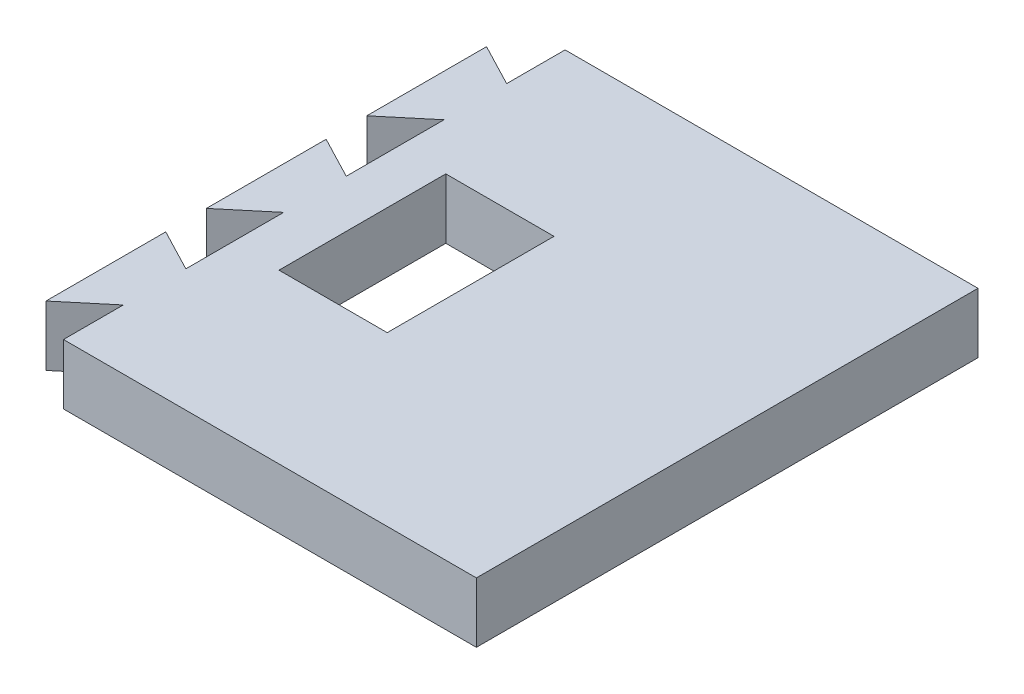
ISO-10303-21;
HEADER;
FILE_DESCRIPTION(('STEP AP214'),'2;1');
FILE_NAME('part.step','',(''),(''),'','','');
FILE_SCHEMA(('AUTOMOTIVE_DESIGN { 1 0 10303 214 1 1 1 1 }'));
ENDSEC;
DATA;
#1=APPLICATION_CONTEXT('core data for automotive mechanical design processes');
#2=APPLICATION_PROTOCOL_DEFINITION('international standard','automotive_design',2000,#1);
#3=PRODUCT_CONTEXT('',#1,'mechanical');
#4=PRODUCT('Part','Part','',(#3));
#5=PRODUCT_RELATED_PRODUCT_CATEGORY('part','',(#4));
#6=PRODUCT_DEFINITION_FORMATION('','',#4);
#7=PRODUCT_DEFINITION_CONTEXT('part definition',#1,'design');
#8=PRODUCT_DEFINITION('design','',#6,#7);
#9=PRODUCT_DEFINITION_SHAPE('','',#8);
#10=(LENGTH_UNIT() NAMED_UNIT(*) SI_UNIT(.MILLI.,.METRE.));
#11=(NAMED_UNIT(*) PLANE_ANGLE_UNIT() SI_UNIT($,.RADIAN.));
#12=(NAMED_UNIT(*) SI_UNIT($,.STERADIAN.) SOLID_ANGLE_UNIT());
#13=UNCERTAINTY_MEASURE_WITH_UNIT(LENGTH_MEASURE(1.E-05),#10,'distance_accuracy_value','');
#14=(GEOMETRIC_REPRESENTATION_CONTEXT(3) GLOBAL_UNCERTAINTY_ASSIGNED_CONTEXT((#13)) GLOBAL_UNIT_ASSIGNED_CONTEXT((#10,
#11,#12)) REPRESENTATION_CONTEXT('',''));
#15=CARTESIAN_POINT('',(0.,0.,0.));
#16=DIRECTION('',(0.,0.,1.));
#17=DIRECTION('',(1.,0.,0.));
#18=AXIS2_PLACEMENT_3D('',#15,#16,#17);
#19=CARTESIAN_POINT('',(0.,15.,0.));
#20=DIRECTION('',(0.,1.,0.));
#21=DIRECTION('',(0.,0.,1.));
#22=AXIS2_PLACEMENT_3D('',#19,#20,#21);
#23=PLANE('',#22);
#24=DIRECTION('',(0.,0.,-1.));
#25=VECTOR('',#24,1.);
#26=CARTESIAN_POINT('',(21.1122765900596,15.,-62.3478624727913));
#27=LINE('',#26,#25);
#28=CARTESIAN_POINT('',(21.1122765900596,15.,-47.9762770127913));
#29=VERTEX_POINT('',#28);
#30=CARTESIAN_POINT('',(21.1122765900596,15.,-62.5478624738082));
#31=VERTEX_POINT('',#30);
#32=EDGE_CURVE('E210',#29,#31,#27,.T.);
#33=ORIENTED_EDGE('',*,*,#32,.F.);
#34=DIRECTION('',(0.88658530162317,0.,0.462565133733351));
#35=VECTOR('',#34,1.);
#36=CARTESIAN_POINT('',(21.1122765900596,15.,-47.9762770127913));
#37=LINE('',#36,#35);
#38=CARTESIAN_POINT('',(10.6179622408717,15.,-53.4515583100163));
#39=VERTEX_POINT('',#38);
#40=EDGE_CURVE('E290',#39,#29,#37,.T.);
#41=ORIENTED_EDGE('',*,*,#40,.F.);
#42=DIRECTION('',(0.,0.,-1.));
#43=VECTOR('',#42,1.);
#44=CARTESIAN_POINT('',(10.6179622408717,15.,-53.4515583100163));
#45=LINE('',#44,#43);
#46=CARTESIAN_POINT('',(10.6179622408717,15.,-23.5922642500163));
#47=VERTEX_POINT('',#46);
#48=EDGE_CURVE('E286',#47,#39,#45,.T.);
#49=ORIENTED_EDGE('',*,*,#48,.F.);
#50=DIRECTION('',(-0.767024936948259,0.,0.641617289433132));
#51=VECTOR('',#50,1.);
#52=CARTESIAN_POINT('',(10.6179622408717,15.,-23.5922642500163));
#53=LINE('',#52,#51);
#54=CARTESIAN_POINT('',(21.1122765900596,15.,-32.3707709227913));
#55=VERTEX_POINT('',#54);
#56=EDGE_CURVE('E282',#55,#47,#53,.T.);
#57=ORIENTED_EDGE('',*,*,#56,.F.);
#58=DIRECTION('',(0.,0.,-1.));
#59=VECTOR('',#58,1.);
#60=CARTESIAN_POINT('',(21.1122765900596,15.,-32.3707709227913));
#61=LINE('',#60,#59);
#62=CARTESIAN_POINT('',(21.1122765900596,15.,-7.97627701279131));
#63=VERTEX_POINT('',#62);
#64=EDGE_CURVE('E278',#63,#55,#61,.T.);
#65=ORIENTED_EDGE('',*,*,#64,.F.);
#66=DIRECTION('',(0.88658530162317,0.,0.462565133733351));
#67=VECTOR('',#66,1.);
#68=CARTESIAN_POINT('',(21.1122765900596,15.,-7.97627701279131));
#69=LINE('',#68,#67);
#70=CARTESIAN_POINT('',(10.6179622408717,15.,-13.4515583100163));
#71=VERTEX_POINT('',#70);
#72=EDGE_CURVE('E274',#71,#63,#69,.T.);
#73=ORIENTED_EDGE('',*,*,#72,.F.);
#74=DIRECTION('',(0.,0.,-1.));
#75=VECTOR('',#74,1.);
#76=CARTESIAN_POINT('',(10.6179622408717,15.,-13.4515583100163));
#77=LINE('',#76,#75);
#78=CARTESIAN_POINT('',(10.6179622408717,15.,16.4077357499837));
#79=VERTEX_POINT('',#78);
#80=EDGE_CURVE('E270',#79,#71,#77,.T.);
#81=ORIENTED_EDGE('',*,*,#80,.F.);
#82=DIRECTION('',(-0.767024936948259,0.,0.641617289433132));
#83=VECTOR('',#82,1.);
#84=CARTESIAN_POINT('',(10.6179622408717,15.,16.4077357499837));
#85=LINE('',#84,#83);
#86=CARTESIAN_POINT('',(21.1122765900596,15.,7.62922907720868));
#87=VERTEX_POINT('',#86);
#88=EDGE_CURVE('E266',#87,#79,#85,.T.);
#89=ORIENTED_EDGE('',*,*,#88,.F.);
#90=DIRECTION('',(0.,0.,-1.));
#91=VECTOR('',#90,1.);
#92=CARTESIAN_POINT('',(21.1122765900596,15.,7.62922907720868));
#93=LINE('',#92,#91);
#94=CARTESIAN_POINT('',(21.1122765900596,15.,32.0237229872087));
#95=VERTEX_POINT('',#94);
#96=EDGE_CURVE('E262',#95,#87,#93,.T.);
#97=ORIENTED_EDGE('',*,*,#96,.F.);
#98=DIRECTION('',(0.886585301623169,0.,0.462565133733352));
#99=VECTOR('',#98,1.);
#100=CARTESIAN_POINT('',(21.1122765900596,15.,32.0237229872087));
#101=LINE('',#100,#99);
#102=CARTESIAN_POINT('',(10.6179622408717,15.,26.5484416899837));
#103=VERTEX_POINT('',#102);
#104=EDGE_CURVE('E258',#103,#95,#101,.T.);
#105=ORIENTED_EDGE('',*,*,#104,.F.);
#106=DIRECTION('',(0.,0.,-1.));
#107=VECTOR('',#106,1.);
#108=CARTESIAN_POINT('',(10.6179622408717,15.,26.5484416899837));
#109=LINE('',#108,#107);
#110=CARTESIAN_POINT('',(10.6179622408717,15.,56.4077357499837));
#111=VERTEX_POINT('',#110);
#112=EDGE_CURVE('E255',#111,#103,#109,.T.);
#113=ORIENTED_EDGE('',*,*,#112,.F.);
#114=DIRECTION('',(-0.767024936948259,0.,0.641617289433132));
#115=VECTOR('',#114,1.);
#116=CARTESIAN_POINT('',(10.6179622408717,15.,56.4077357499837));
#117=LINE('',#116,#115);
#118=CARTESIAN_POINT('',(21.1122765900596,15.,47.6292290772087));
#119=VERTEX_POINT('',#118);
#120=EDGE_CURVE('E186',#119,#111,#117,.T.);
#121=ORIENTED_EDGE('',*,*,#120,.F.);
#122=DIRECTION('',(0.,0.,-1.));
#123=VECTOR('',#122,1.);
#124=CARTESIAN_POINT('',(21.1122765900596,15.,47.6292290772087));
#125=LINE('',#124,#123);
#126=CARTESIAN_POINT('',(21.1122765900596,15.,62.5478624738082));
#127=VERTEX_POINT('',#126);
#128=EDGE_CURVE('E250',#127,#119,#125,.T.);
#129=ORIENTED_EDGE('',*,*,#128,.F.);
#130=DIRECTION('',(-1.,0.,0.));
#131=VECTOR('',#130,1.);
#132=CARTESIAN_POINT('',(0.,15.,62.5478624738082));
#133=LINE('',#132,#131);
#134=CARTESIAN_POINT('',(124.086888456103,15.,62.5478624738082));
#135=VERTEX_POINT('',#134);
#136=EDGE_CURVE('E11',#135,#127,#133,.T.);
#137=ORIENTED_EDGE('',*,*,#136,.F.);
#138=DIRECTION('',(0.,0.,1.));
#139=VECTOR('',#138,1.);
#140=CARTESIAN_POINT('',(124.086888456103,15.,0.));
#141=LINE('',#140,#139);
#142=CARTESIAN_POINT('',(124.086888456103,15.,-62.5478624738082));
#143=VERTEX_POINT('',#142);
#144=EDGE_CURVE('E53',#143,#135,#141,.T.);
#145=ORIENTED_EDGE('',*,*,#144,.F.);
#146=DIRECTION('',(-1.,0.,0.));
#147=VECTOR('',#146,1.);
#148=CARTESIAN_POINT('',(0.,15.,-62.5478624738082));
#149=LINE('',#148,#147);
#150=EDGE_CURVE('E368',#143,#31,#149,.T.);
#151=ORIENTED_EDGE('',*,*,#150,.T.);
#152=EDGE_LOOP('',(#33,#41,#49,#57,#65,#73,#81,#89,#97,#105,#113,#121,#129,#137,#145,#151));
#153=FACE_BOUND('',#152,.T.);
#154=DIRECTION('',(-1.,0.,0.));
#155=VECTOR('',#154,1.);
#156=CARTESIAN_POINT('',(60.,15.,-20.8977631628507));
#157=LINE('',#156,#155);
#158=CARTESIAN_POINT('',(60.,15.,-20.8977631628507));
#159=VERTEX_POINT('',#158);
#160=CARTESIAN_POINT('',(33.01537257,15.,-20.8977631628507));
#161=VERTEX_POINT('',#160);
#162=EDGE_CURVE('E69',#159,#161,#157,.T.);
#163=ORIENTED_EDGE('',*,*,#162,.F.);
#164=DIRECTION('',(0.,0.,-1.));
#165=VECTOR('',#164,1.);
#166=CARTESIAN_POINT('',(60.,15.,-20.8977631628507));
#167=LINE('',#166,#165);
#168=CARTESIAN_POINT('',(60.,15.,20.6977631671492));
#169=VERTEX_POINT('',#168);
#170=EDGE_CURVE('E339',#169,#159,#167,.T.);
#171=ORIENTED_EDGE('',*,*,#170,.F.);
#172=DIRECTION('',(1.,0.,0.));
#173=VECTOR('',#172,1.);
#174=CARTESIAN_POINT('',(33.01537257,15.,20.6977631671493));
#175=LINE('',#174,#173);
#176=CARTESIAN_POINT('',(33.01537257,15.,20.6977631671493));
#177=VERTEX_POINT('',#176);
#178=EDGE_CURVE('E358',#177,#169,#175,.T.);
#179=ORIENTED_EDGE('',*,*,#178,.F.);
#180=DIRECTION('',(0.,0.,1.));
#181=VECTOR('',#180,1.);
#182=CARTESIAN_POINT('',(33.01537257,15.,-20.8977631628507));
#183=LINE('',#182,#181);
#184=EDGE_CURVE('E354',#161,#177,#183,.T.);
#185=ORIENTED_EDGE('',*,*,#184,.F.);
#186=EDGE_LOOP('',(#163,#171,#179,#185));
#187=FACE_BOUND('',#186,.T.);
#188=ADVANCED_FACE('F43',(#153,#187),#23,.T.);
#189=CARTESIAN_POINT('',(0.,453.230154540027,-62.5478624738082));
#190=DIRECTION('',(0.,0.,1.));
#191=DIRECTION('',(1.,0.,0.));
#192=AXIS2_PLACEMENT_3D('',#189,#190,#191);
#193=PLANE('',#192);
#194=DIRECTION('',(-1.,0.,0.));
#195=VECTOR('',#194,1.);
#196=CARTESIAN_POINT('',(0.,0.,-62.5478624738082));
#197=LINE('',#196,#195);
#198=CARTESIAN_POINT('',(124.086888456103,0.,-62.5478624738082));
#199=VERTEX_POINT('',#198);
#200=CARTESIAN_POINT('',(21.1122765900596,0.,-62.5478624738082));
#201=VERTEX_POINT('',#200);
#202=EDGE_CURVE('E380',#199,#201,#197,.T.);
#203=ORIENTED_EDGE('',*,*,#202,.T.);
#204=DIRECTION('',(0.,1.,0.));
#205=VECTOR('',#204,1.);
#206=CARTESIAN_POINT('',(21.1122765900596,453.230154540027,-62.5478624738082));
#207=LINE('',#206,#205);
#208=EDGE_CURVE('E330',#201,#31,#207,.T.);
#209=ORIENTED_EDGE('',*,*,#208,.T.);
#210=ORIENTED_EDGE('',*,*,#150,.F.);
#211=DIRECTION('',(0.,-1.,0.));
#212=VECTOR('',#211,1.);
#213=CARTESIAN_POINT('',(124.086888456103,453.230154540027,-62.5478624738082));
#214=LINE('',#213,#212);
#215=EDGE_CURVE('E385',#143,#199,#214,.T.);
#216=ORIENTED_EDGE('',*,*,#215,.T.);
#217=EDGE_LOOP('',(#203,#209,#210,#216));
#218=FACE_BOUND('',#217,.T.);
#219=ADVANCED_FACE('F397',(#218),#193,.F.);
#220=CARTESIAN_POINT('',(124.086888456103,453.230154540027,0.));
#221=DIRECTION('',(1.,0.,0.));
#222=DIRECTION('',(0.,0.,-1.));
#223=AXIS2_PLACEMENT_3D('',#220,#221,#222);
#224=PLANE('',#223);
#225=ORIENTED_EDGE('',*,*,#144,.T.);
#226=DIRECTION('',(0.,-1.,0.));
#227=VECTOR('',#226,1.);
#228=CARTESIAN_POINT('',(124.086888456103,453.230154540027,62.5478624738082));
#229=LINE('',#228,#227);
#230=CARTESIAN_POINT('',(124.086888456103,0.,62.5478624738082));
#231=VERTEX_POINT('',#230);
#232=EDGE_CURVE('E47',#135,#231,#229,.T.);
#233=ORIENTED_EDGE('',*,*,#232,.T.);
#234=DIRECTION('',(0.,0.,1.));
#235=VECTOR('',#234,1.);
#236=CARTESIAN_POINT('',(124.086888456103,0.,0.));
#237=LINE('',#236,#235);
#238=EDGE_CURVE('E381',#199,#231,#237,.T.);
#239=ORIENTED_EDGE('',*,*,#238,.F.);
#240=ORIENTED_EDGE('',*,*,#215,.F.);
#241=EDGE_LOOP('',(#225,#233,#239,#240));
#242=FACE_BOUND('',#241,.T.);
#243=ADVANCED_FACE('F401',(#242),#224,.T.);
#244=CARTESIAN_POINT('',(0.,453.230154540027,62.5478624738082));
#245=DIRECTION('',(0.,0.,1.));
#246=DIRECTION('',(1.,0.,0.));
#247=AXIS2_PLACEMENT_3D('',#244,#245,#246);
#248=PLANE('',#247);
#249=DIRECTION('',(0.,1.,0.));
#250=VECTOR('',#249,1.);
#251=CARTESIAN_POINT('',(21.1122765900596,453.230154540027,62.5478624738082));
#252=LINE('',#251,#250);
#253=CARTESIAN_POINT('',(21.1122765900596,0.,62.5478624738082));
#254=VERTEX_POINT('',#253);
#255=EDGE_CURVE('E299',#254,#127,#252,.T.);
#256=ORIENTED_EDGE('',*,*,#255,.F.);
#257=DIRECTION('',(-1.,0.,0.));
#258=VECTOR('',#257,1.);
#259=CARTESIAN_POINT('',(0.,0.,62.5478624738082));
#260=LINE('',#259,#258);
#261=EDGE_CURVE('E377',#231,#254,#260,.T.);
#262=ORIENTED_EDGE('',*,*,#261,.F.);
#263=ORIENTED_EDGE('',*,*,#232,.F.);
#264=ORIENTED_EDGE('',*,*,#136,.T.);
#265=EDGE_LOOP('',(#256,#262,#263,#264));
#266=FACE_BOUND('',#265,.T.);
#267=ADVANCED_FACE('F416',(#266),#248,.T.);
#268=CARTESIAN_POINT('',(0.,0.,0.));
#269=DIRECTION('',(0.,1.,0.));
#270=DIRECTION('',(0.,0.,1.));
#271=AXIS2_PLACEMENT_3D('',#268,#269,#270);
#272=PLANE('',#271);
#273=DIRECTION('',(0.,0.,-1.));
#274=VECTOR('',#273,1.);
#275=CARTESIAN_POINT('',(60.,0.,-20.8977631628507));
#276=LINE('',#275,#274);
#277=CARTESIAN_POINT('',(60.,0.,20.6977631671492));
#278=VERTEX_POINT('',#277);
#279=CARTESIAN_POINT('',(60.,0.,-20.8977631628507));
#280=VERTEX_POINT('',#279);
#281=EDGE_CURVE('E347',#278,#280,#276,.T.);
#282=ORIENTED_EDGE('',*,*,#281,.T.);
#283=DIRECTION('',(-1.,0.,0.));
#284=VECTOR('',#283,1.);
#285=CARTESIAN_POINT('',(60.,0.,-20.8977631628507));
#286=LINE('',#285,#284);
#287=CARTESIAN_POINT('',(33.01537257,0.,-20.8977631628507));
#288=VERTEX_POINT('',#287);
#289=EDGE_CURVE('E334',#280,#288,#286,.T.);
#290=ORIENTED_EDGE('',*,*,#289,.T.);
#291=DIRECTION('',(0.,0.,1.));
#292=VECTOR('',#291,1.);
#293=CARTESIAN_POINT('',(33.01537257,0.,-20.8977631628507));
#294=LINE('',#293,#292);
#295=CARTESIAN_POINT('',(33.01537257,0.,20.6977631671493));
#296=VERTEX_POINT('',#295);
#297=EDGE_CURVE('E338',#288,#296,#294,.T.);
#298=ORIENTED_EDGE('',*,*,#297,.T.);
#299=DIRECTION('',(1.,0.,0.));
#300=VECTOR('',#299,1.);
#301=CARTESIAN_POINT('',(33.01537257,0.,20.6977631671493));
#302=LINE('',#301,#300);
#303=EDGE_CURVE('E343',#296,#278,#302,.T.);
#304=ORIENTED_EDGE('',*,*,#303,.T.);
#305=EDGE_LOOP('',(#282,#290,#298,#304));
#306=FACE_BOUND('',#305,.T.);
#307=DIRECTION('',(0.88658530162317,0.,0.462565133733351));
#308=VECTOR('',#307,1.);
#309=CARTESIAN_POINT('',(21.1122765900596,0.,-47.9762770127913));
#310=LINE('',#309,#308);
#311=CARTESIAN_POINT('',(10.6179622408717,0.,-53.4515583100163));
#312=VERTEX_POINT('',#311);
#313=CARTESIAN_POINT('',(21.1122765900596,0.,-47.9762770127913));
#314=VERTEX_POINT('',#313);
#315=EDGE_CURVE('E243',#312,#314,#310,.T.);
#316=ORIENTED_EDGE('',*,*,#315,.T.);
#317=DIRECTION('',(0.,0.,-1.));
#318=VECTOR('',#317,1.);
#319=CARTESIAN_POINT('',(21.1122765900596,0.,-62.3478624727913));
#320=LINE('',#319,#318);
#321=EDGE_CURVE('E246',#314,#201,#320,.T.);
#322=ORIENTED_EDGE('',*,*,#321,.T.);
#323=ORIENTED_EDGE('',*,*,#202,.F.);
#324=ORIENTED_EDGE('',*,*,#238,.T.);
#325=ORIENTED_EDGE('',*,*,#261,.T.);
#326=DIRECTION('',(0.,0.,-1.));
#327=VECTOR('',#326,1.);
#328=CARTESIAN_POINT('',(21.1122765900596,0.,67.0487876325794));
#329=LINE('',#328,#327);
#330=CARTESIAN_POINT('',(21.1122765900596,0.,47.6292290772087));
#331=VERTEX_POINT('',#330);
#332=EDGE_CURVE('E206',#254,#331,#329,.T.);
#333=ORIENTED_EDGE('',*,*,#332,.T.);
#334=DIRECTION('',(-0.767024936948259,0.,0.641617289433132));
#335=VECTOR('',#334,1.);
#336=CARTESIAN_POINT('',(10.6179622408717,0.,56.4077357499837));
#337=LINE('',#336,#335);
#338=CARTESIAN_POINT('',(10.6179622408717,0.,56.4077357499837));
#339=VERTEX_POINT('',#338);
#340=EDGE_CURVE('E61',#331,#339,#337,.T.);
#341=ORIENTED_EDGE('',*,*,#340,.T.);
#342=DIRECTION('',(0.,0.,-1.));
#343=VECTOR('',#342,1.);
#344=CARTESIAN_POINT('',(10.6179622408717,0.,26.5484416899837));
#345=LINE('',#344,#343);
#346=CARTESIAN_POINT('',(10.6179622408717,0.,26.5484416899837));
#347=VERTEX_POINT('',#346);
#348=EDGE_CURVE('E195',#339,#347,#345,.T.);
#349=ORIENTED_EDGE('',*,*,#348,.T.);
#350=DIRECTION('',(0.886585301623169,0.,0.462565133733352));
#351=VECTOR('',#350,1.);
#352=CARTESIAN_POINT('',(21.1122765900596,0.,32.0237229872087));
#353=LINE('',#352,#351);
#354=CARTESIAN_POINT('',(21.1122765900596,0.,32.0237229872087));
#355=VERTEX_POINT('',#354);
#356=EDGE_CURVE('E201',#347,#355,#353,.T.);
#357=ORIENTED_EDGE('',*,*,#356,.T.);
#358=DIRECTION('',(0.,0.,-1.));
#359=VECTOR('',#358,1.);
#360=CARTESIAN_POINT('',(21.1122765900596,0.,7.62922907720868));
#361=LINE('',#360,#359);
#362=CARTESIAN_POINT('',(21.1122765900596,0.,7.62922907720868));
#363=VERTEX_POINT('',#362);
#364=EDGE_CURVE('E215',#355,#363,#361,.T.);
#365=ORIENTED_EDGE('',*,*,#364,.T.);
#366=DIRECTION('',(-0.767024936948259,0.,0.641617289433132));
#367=VECTOR('',#366,1.);
#368=CARTESIAN_POINT('',(10.6179622408717,0.,16.4077357499837));
#369=LINE('',#368,#367);
#370=CARTESIAN_POINT('',(10.6179622408717,0.,16.4077357499837));
#371=VERTEX_POINT('',#370);
#372=EDGE_CURVE('E219',#363,#371,#369,.T.);
#373=ORIENTED_EDGE('',*,*,#372,.T.);
#374=DIRECTION('',(0.,0.,-1.));
#375=VECTOR('',#374,1.);
#376=CARTESIAN_POINT('',(10.6179622408717,0.,-13.4515583100163));
#377=LINE('',#376,#375);
#378=CARTESIAN_POINT('',(10.6179622408717,0.,-13.4515583100163));
#379=VERTEX_POINT('',#378);
#380=EDGE_CURVE('E223',#371,#379,#377,.T.);
#381=ORIENTED_EDGE('',*,*,#380,.T.);
#382=DIRECTION('',(0.88658530162317,0.,0.462565133733351));
#383=VECTOR('',#382,1.);
#384=CARTESIAN_POINT('',(21.1122765900596,0.,-7.97627701279131));
#385=LINE('',#384,#383);
#386=CARTESIAN_POINT('',(21.1122765900596,0.,-7.97627701279131));
#387=VERTEX_POINT('',#386);
#388=EDGE_CURVE('E227',#379,#387,#385,.T.);
#389=ORIENTED_EDGE('',*,*,#388,.T.);
#390=DIRECTION('',(0.,0.,-1.));
#391=VECTOR('',#390,1.);
#392=CARTESIAN_POINT('',(21.1122765900596,0.,-32.3707709227913));
#393=LINE('',#392,#391);
#394=CARTESIAN_POINT('',(21.1122765900596,0.,-32.3707709227913));
#395=VERTEX_POINT('',#394);
#396=EDGE_CURVE('E231',#387,#395,#393,.T.);
#397=ORIENTED_EDGE('',*,*,#396,.T.);
#398=DIRECTION('',(-0.767024936948259,0.,0.641617289433132));
#399=VECTOR('',#398,1.);
#400=CARTESIAN_POINT('',(10.6179622408717,0.,-23.5922642500163));
#401=LINE('',#400,#399);
#402=CARTESIAN_POINT('',(10.6179622408717,0.,-23.5922642500163));
#403=VERTEX_POINT('',#402);
#404=EDGE_CURVE('E235',#395,#403,#401,.T.);
#405=ORIENTED_EDGE('',*,*,#404,.T.);
#406=DIRECTION('',(0.,0.,-1.));
#407=VECTOR('',#406,1.);
#408=CARTESIAN_POINT('',(10.6179622408717,0.,-53.4515583100163));
#409=LINE('',#408,#407);
#410=EDGE_CURVE('E239',#403,#312,#409,.T.);
#411=ORIENTED_EDGE('',*,*,#410,.T.);
#412=EDGE_LOOP('',(#316,#322,#323,#324,#325,#333,#341,#349,#357,#365,#373,#381,#389,#397,#405,#411));
#413=FACE_BOUND('',#412,.T.);
#414=ADVANCED_FACE('F45',(#306,#413),#272,.F.);
#415=CARTESIAN_POINT('',(60.,0.,-20.8977631628507));
#416=DIRECTION('',(0.,0.,-1.));
#417=DIRECTION('',(-1.,0.,0.));
#418=AXIS2_PLACEMENT_3D('',#415,#416,#417);
#419=PLANE('',#418);
#420=ORIENTED_EDGE('',*,*,#162,.T.);
#421=DIRECTION('',(0.,1.,0.));
#422=VECTOR('',#421,1.);
#423=CARTESIAN_POINT('',(33.01537257,0.,-20.8977631628507));
#424=LINE('',#423,#422);
#425=EDGE_CURVE('E351',#288,#161,#424,.T.);
#426=ORIENTED_EDGE('',*,*,#425,.F.);
#427=ORIENTED_EDGE('',*,*,#289,.F.);
#428=DIRECTION('',(0.,1.,0.));
#429=VECTOR('',#428,1.);
#430=CARTESIAN_POINT('',(60.,0.,-20.8977631628507));
#431=LINE('',#430,#429);
#432=EDGE_CURVE('E365',#280,#159,#431,.T.);
#433=ORIENTED_EDGE('',*,*,#432,.T.);
#434=EDGE_LOOP('',(#420,#426,#427,#433));
#435=FACE_BOUND('',#434,.T.);
#436=ADVANCED_FACE('F474',(#435),#419,.F.);
#437=CARTESIAN_POINT('',(60.,0.,-20.8977631628507));
#438=DIRECTION('',(1.,0.,0.));
#439=DIRECTION('',(0.,0.,-1.));
#440=AXIS2_PLACEMENT_3D('',#437,#438,#439);
#441=PLANE('',#440);
#442=ORIENTED_EDGE('',*,*,#170,.T.);
#443=ORIENTED_EDGE('',*,*,#432,.F.);
#444=ORIENTED_EDGE('',*,*,#281,.F.);
#445=DIRECTION('',(0.,1.,0.));
#446=VECTOR('',#445,1.);
#447=CARTESIAN_POINT('',(60.,0.,20.6977631671492));
#448=LINE('',#447,#446);
#449=EDGE_CURVE('E369',#278,#169,#448,.T.);
#450=ORIENTED_EDGE('',*,*,#449,.T.);
#451=EDGE_LOOP('',(#442,#443,#444,#450));
#452=FACE_BOUND('',#451,.T.);
#453=ADVANCED_FACE('F476',(#452),#441,.F.);
#454=CARTESIAN_POINT('',(33.01537257,0.,20.6977631671493));
#455=DIRECTION('',(0.,0.,1.));
#456=DIRECTION('',(1.,0.,0.));
#457=AXIS2_PLACEMENT_3D('',#454,#455,#456);
#458=PLANE('',#457);
#459=ORIENTED_EDGE('',*,*,#178,.T.);
#460=ORIENTED_EDGE('',*,*,#449,.F.);
#461=ORIENTED_EDGE('',*,*,#303,.F.);
#462=DIRECTION('',(0.,1.,0.));
#463=VECTOR('',#462,1.);
#464=CARTESIAN_POINT('',(33.01537257,0.,20.6977631671493));
#465=LINE('',#464,#463);
#466=EDGE_CURVE('E372',#296,#177,#465,.T.);
#467=ORIENTED_EDGE('',*,*,#466,.T.);
#468=EDGE_LOOP('',(#459,#460,#461,#467));
#469=FACE_BOUND('',#468,.T.);
#470=ADVANCED_FACE('F479',(#469),#458,.F.);
#471=CARTESIAN_POINT('',(33.01537257,0.,-20.8977631628507));
#472=DIRECTION('',(-1.,0.,0.));
#473=DIRECTION('',(0.,0.,1.));
#474=AXIS2_PLACEMENT_3D('',#471,#472,#473);
#475=PLANE('',#474);
#476=ORIENTED_EDGE('',*,*,#184,.T.);
#477=ORIENTED_EDGE('',*,*,#466,.F.);
#478=ORIENTED_EDGE('',*,*,#297,.F.);
#479=ORIENTED_EDGE('',*,*,#425,.T.);
#480=EDGE_LOOP('',(#476,#477,#478,#479));
#481=FACE_BOUND('',#480,.T.);
#482=ADVANCED_FACE('F460',(#481),#475,.F.);
#483=CARTESIAN_POINT('',(21.1122765900596,0.,-62.3478624727913));
#484=DIRECTION('',(1.,0.,0.));
#485=DIRECTION('',(0.,0.,-1.));
#486=AXIS2_PLACEMENT_3D('',#483,#484,#485);
#487=PLANE('',#486);
#488=ORIENTED_EDGE('',*,*,#321,.F.);
#489=DIRECTION('',(0.,1.,0.));
#490=VECTOR('',#489,1.);
#491=CARTESIAN_POINT('',(21.1122765900596,0.,-47.9762770127913));
#492=LINE('',#491,#490);
#493=EDGE_CURVE('E296',#314,#29,#492,.T.);
#494=ORIENTED_EDGE('',*,*,#493,.T.);
#495=ORIENTED_EDGE('',*,*,#32,.T.);
#496=ORIENTED_EDGE('',*,*,#208,.F.);
#497=EDGE_LOOP('',(#488,#494,#495,#496));
#498=FACE_BOUND('',#497,.T.);
#499=ADVANCED_FACE('F407',(#498),#487,.F.);
#500=CARTESIAN_POINT('',(21.1122765900596,0.,-47.9762770127913));
#501=DIRECTION('',(-0.462565133733351,0.,0.88658530162317));
#502=DIRECTION('',(0.88658530162317,0.,0.462565133733351));
#503=AXIS2_PLACEMENT_3D('',#500,#501,#502);
#504=PLANE('',#503);
#505=ORIENTED_EDGE('',*,*,#40,.T.);
#506=ORIENTED_EDGE('',*,*,#493,.F.);
#507=ORIENTED_EDGE('',*,*,#315,.F.);
#508=DIRECTION('',(0.,1.,0.));
#509=VECTOR('',#508,1.);
#510=CARTESIAN_POINT('',(10.6179622408717,0.,-53.4515583100163));
#511=LINE('',#510,#509);
#512=EDGE_CURVE('E300',#312,#39,#511,.T.);
#513=ORIENTED_EDGE('',*,*,#512,.T.);
#514=EDGE_LOOP('',(#505,#506,#507,#513));
#515=FACE_BOUND('',#514,.T.);
#516=ADVANCED_FACE('F452',(#515),#504,.F.);
#517=CARTESIAN_POINT('',(10.6179622408717,0.,-53.4515583100163));
#518=DIRECTION('',(1.,0.,0.));
#519=DIRECTION('',(0.,0.,-1.));
#520=AXIS2_PLACEMENT_3D('',#517,#518,#519);
#521=PLANE('',#520);
#522=ORIENTED_EDGE('',*,*,#48,.T.);
#523=ORIENTED_EDGE('',*,*,#512,.F.);
#524=ORIENTED_EDGE('',*,*,#410,.F.);
#525=DIRECTION('',(0.,1.,0.));
#526=VECTOR('',#525,1.);
#527=CARTESIAN_POINT('',(10.6179622408717,0.,-23.5922642500163));
#528=LINE('',#527,#526);
#529=EDGE_CURVE('E303',#403,#47,#528,.T.);
#530=ORIENTED_EDGE('',*,*,#529,.T.);
#531=EDGE_LOOP('',(#522,#523,#524,#530));
#532=FACE_BOUND('',#531,.T.);
#533=ADVANCED_FACE('F449',(#532),#521,.F.);
#534=CARTESIAN_POINT('',(10.6179622408717,0.,-23.5922642500163));
#535=DIRECTION('',(-0.641617289433132,0.,-0.767024936948259));
#536=DIRECTION('',(-0.767024936948259,0.,0.641617289433132));
#537=AXIS2_PLACEMENT_3D('',#534,#535,#536);
#538=PLANE('',#537);
#539=ORIENTED_EDGE('',*,*,#56,.T.);
#540=ORIENTED_EDGE('',*,*,#529,.F.);
#541=ORIENTED_EDGE('',*,*,#404,.F.);
#542=DIRECTION('',(0.,1.,0.));
#543=VECTOR('',#542,1.);
#544=CARTESIAN_POINT('',(21.1122765900596,0.,-32.3707709227913));
#545=LINE('',#544,#543);
#546=EDGE_CURVE('E306',#395,#55,#545,.T.);
#547=ORIENTED_EDGE('',*,*,#546,.T.);
#548=EDGE_LOOP('',(#539,#540,#541,#547));
#549=FACE_BOUND('',#548,.T.);
#550=ADVANCED_FACE('F446',(#549),#538,.F.);
#551=CARTESIAN_POINT('',(21.1122765900596,0.,-32.3707709227913));
#552=DIRECTION('',(1.,0.,0.));
#553=DIRECTION('',(0.,0.,-1.));
#554=AXIS2_PLACEMENT_3D('',#551,#552,#553);
#555=PLANE('',#554);
#556=ORIENTED_EDGE('',*,*,#64,.T.);
#557=ORIENTED_EDGE('',*,*,#546,.F.);
#558=ORIENTED_EDGE('',*,*,#396,.F.);
#559=DIRECTION('',(0.,1.,0.));
#560=VECTOR('',#559,1.);
#561=CARTESIAN_POINT('',(21.1122765900596,0.,-7.97627701279131));
#562=LINE('',#561,#560);
#563=EDGE_CURVE('E309',#387,#63,#562,.T.);
#564=ORIENTED_EDGE('',*,*,#563,.T.);
#565=EDGE_LOOP('',(#556,#557,#558,#564));
#566=FACE_BOUND('',#565,.T.);
#567=ADVANCED_FACE('F442',(#566),#555,.F.);
#568=CARTESIAN_POINT('',(21.1122765900596,0.,-7.97627701279131));
#569=DIRECTION('',(-0.462565133733351,0.,0.88658530162317));
#570=DIRECTION('',(0.88658530162317,0.,0.462565133733352));
#571=AXIS2_PLACEMENT_3D('',#568,#569,#570);
#572=PLANE('',#571);
#573=ORIENTED_EDGE('',*,*,#72,.T.);
#574=ORIENTED_EDGE('',*,*,#563,.F.);
#575=ORIENTED_EDGE('',*,*,#388,.F.);
#576=DIRECTION('',(0.,1.,0.));
#577=VECTOR('',#576,1.);
#578=CARTESIAN_POINT('',(10.6179622408717,0.,-13.4515583100163));
#579=LINE('',#578,#577);
#580=EDGE_CURVE('E312',#379,#71,#579,.T.);
#581=ORIENTED_EDGE('',*,*,#580,.T.);
#582=EDGE_LOOP('',(#573,#574,#575,#581));
#583=FACE_BOUND('',#582,.T.);
#584=ADVANCED_FACE('F438',(#583),#572,.F.);
#585=CARTESIAN_POINT('',(10.6179622408717,0.,-13.4515583100163));
#586=DIRECTION('',(1.,0.,0.));
#587=DIRECTION('',(0.,0.,-1.));
#588=AXIS2_PLACEMENT_3D('',#585,#586,#587);
#589=PLANE('',#588);
#590=ORIENTED_EDGE('',*,*,#80,.T.);
#591=ORIENTED_EDGE('',*,*,#580,.F.);
#592=ORIENTED_EDGE('',*,*,#380,.F.);
#593=DIRECTION('',(0.,1.,0.));
#594=VECTOR('',#593,1.);
#595=CARTESIAN_POINT('',(10.6179622408717,0.,16.4077357499837));
#596=LINE('',#595,#594);
#597=EDGE_CURVE('E315',#371,#79,#596,.T.);
#598=ORIENTED_EDGE('',*,*,#597,.T.);
#599=EDGE_LOOP('',(#590,#591,#592,#598));
#600=FACE_BOUND('',#599,.T.);
#601=ADVANCED_FACE('F434',(#600),#589,.F.);
#602=CARTESIAN_POINT('',(10.6179622408717,0.,16.4077357499837));
#603=DIRECTION('',(-0.641617289433132,0.,-0.767024936948259));
#604=DIRECTION('',(-0.767024936948259,0.,0.641617289433132));
#605=AXIS2_PLACEMENT_3D('',#602,#603,#604);
#606=PLANE('',#605);
#607=ORIENTED_EDGE('',*,*,#88,.T.);
#608=ORIENTED_EDGE('',*,*,#597,.F.);
#609=ORIENTED_EDGE('',*,*,#372,.F.);
#610=DIRECTION('',(0.,1.,0.));
#611=VECTOR('',#610,1.);
#612=CARTESIAN_POINT('',(21.1122765900596,0.,7.62922907720868));
#613=LINE('',#612,#611);
#614=EDGE_CURVE('E318',#363,#87,#613,.T.);
#615=ORIENTED_EDGE('',*,*,#614,.T.);
#616=EDGE_LOOP('',(#607,#608,#609,#615));
#617=FACE_BOUND('',#616,.T.);
#618=ADVANCED_FACE('F430',(#617),#606,.F.);
#619=CARTESIAN_POINT('',(21.1122765900596,0.,7.62922907720868));
#620=DIRECTION('',(1.,0.,0.));
#621=DIRECTION('',(0.,0.,-1.));
#622=AXIS2_PLACEMENT_3D('',#619,#620,#621);
#623=PLANE('',#622);
#624=ORIENTED_EDGE('',*,*,#96,.T.);
#625=ORIENTED_EDGE('',*,*,#614,.F.);
#626=ORIENTED_EDGE('',*,*,#364,.F.);
#627=DIRECTION('',(0.,1.,0.));
#628=VECTOR('',#627,1.);
#629=CARTESIAN_POINT('',(21.1122765900596,0.,32.0237229872087));
#630=LINE('',#629,#628);
#631=EDGE_CURVE('E321',#355,#95,#630,.T.);
#632=ORIENTED_EDGE('',*,*,#631,.T.);
#633=EDGE_LOOP('',(#624,#625,#626,#632));
#634=FACE_BOUND('',#633,.T.);
#635=ADVANCED_FACE('F428',(#634),#623,.F.);
#636=CARTESIAN_POINT('',(21.1122765900596,0.,32.0237229872087));
#637=DIRECTION('',(-0.462565133733352,0.,0.88658530162317));
#638=DIRECTION('',(0.88658530162317,0.,0.462565133733352));
#639=AXIS2_PLACEMENT_3D('',#636,#637,#638);
#640=PLANE('',#639);
#641=ORIENTED_EDGE('',*,*,#104,.T.);
#642=ORIENTED_EDGE('',*,*,#631,.F.);
#643=ORIENTED_EDGE('',*,*,#356,.F.);
#644=DIRECTION('',(0.,1.,0.));
#645=VECTOR('',#644,1.);
#646=CARTESIAN_POINT('',(10.6179622408717,0.,26.5484416899837));
#647=LINE('',#646,#645);
#648=EDGE_CURVE('E191',#347,#103,#647,.T.);
#649=ORIENTED_EDGE('',*,*,#648,.T.);
#650=EDGE_LOOP('',(#641,#642,#643,#649));
#651=FACE_BOUND('',#650,.T.);
#652=ADVANCED_FACE('F424',(#651),#640,.F.);
#653=CARTESIAN_POINT('',(10.6179622408717,0.,26.5484416899837));
#654=DIRECTION('',(1.,0.,0.));
#655=DIRECTION('',(0.,0.,-1.));
#656=AXIS2_PLACEMENT_3D('',#653,#654,#655);
#657=PLANE('',#656);
#658=ORIENTED_EDGE('',*,*,#112,.T.);
#659=ORIENTED_EDGE('',*,*,#648,.F.);
#660=ORIENTED_EDGE('',*,*,#348,.F.);
#661=DIRECTION('',(0.,1.,0.));
#662=VECTOR('',#661,1.);
#663=CARTESIAN_POINT('',(10.6179622408717,0.,56.4077357499837));
#664=LINE('',#663,#662);
#665=EDGE_CURVE('E182',#339,#111,#664,.T.);
#666=ORIENTED_EDGE('',*,*,#665,.T.);
#667=EDGE_LOOP('',(#658,#659,#660,#666));
#668=FACE_BOUND('',#667,.T.);
#669=ADVANCED_FACE('F196',(#668),#657,.F.);
#670=CARTESIAN_POINT('',(10.6179622408717,0.,56.4077357499837));
#671=DIRECTION('',(-0.641617289433132,0.,-0.767024936948259));
#672=DIRECTION('',(-0.767024936948259,0.,0.641617289433132));
#673=AXIS2_PLACEMENT_3D('',#670,#671,#672);
#674=PLANE('',#673);
#675=ORIENTED_EDGE('',*,*,#120,.T.);
#676=ORIENTED_EDGE('',*,*,#665,.F.);
#677=ORIENTED_EDGE('',*,*,#340,.F.);
#678=DIRECTION('',(0.,1.,0.));
#679=VECTOR('',#678,1.);
#680=CARTESIAN_POINT('',(21.1122765900596,0.,47.6292290772087));
#681=LINE('',#680,#679);
#682=EDGE_CURVE('E192',#331,#119,#681,.T.);
#683=ORIENTED_EDGE('',*,*,#682,.T.);
#684=EDGE_LOOP('',(#675,#676,#677,#683));
#685=FACE_BOUND('',#684,.T.);
#686=ADVANCED_FACE('F184',(#685),#674,.F.);
#687=CARTESIAN_POINT('',(21.1122765900596,0.,47.6292290772087));
#688=DIRECTION('',(1.,0.,0.));
#689=DIRECTION('',(0.,0.,-1.));
#690=AXIS2_PLACEMENT_3D('',#687,#688,#689);
#691=PLANE('',#690);
#692=ORIENTED_EDGE('',*,*,#255,.T.);
#693=ORIENTED_EDGE('',*,*,#128,.T.);
#694=ORIENTED_EDGE('',*,*,#682,.F.);
#695=ORIENTED_EDGE('',*,*,#332,.F.);
#696=EDGE_LOOP('',(#692,#693,#694,#695));
#697=FACE_BOUND('',#696,.T.);
#698=ADVANCED_FACE('F419',(#697),#691,.F.);
#699=CLOSED_SHELL('',(#188,#219,#243,#267,#414,#436,#453,#470,#482,#499,#516,#533,#550,#567,
#584,#601,#618,#635,#652,#669,#686,#698));
#700=MANIFOLD_SOLID_BREP('B2',#699);
#701=ADVANCED_BREP_SHAPE_REPRESENTATION('',(#18,#700),#14);
#702=SHAPE_DEFINITION_REPRESENTATION(#9,#701);
ENDSEC;
END-ISO-10303-21;
